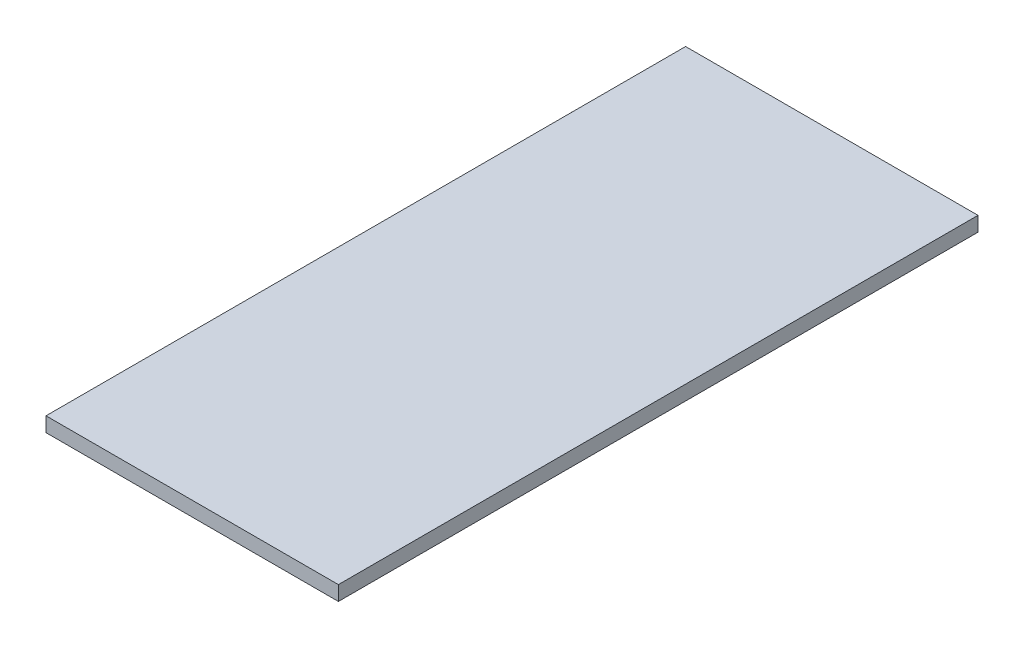
ISO-10303-21;
HEADER;
FILE_DESCRIPTION(('STEP AP214'),'2;1');
FILE_NAME('part.step','',(''),(''),'','','');
FILE_SCHEMA(('AUTOMOTIVE_DESIGN { 1 0 10303 214 1 1 1 1 }'));
ENDSEC;
DATA;
#1=APPLICATION_CONTEXT('core data for automotive mechanical design processes');
#2=APPLICATION_PROTOCOL_DEFINITION('international standard','automotive_design',2000,#1);
#3=PRODUCT_CONTEXT('',#1,'mechanical');
#4=PRODUCT('Part','Part','',(#3));
#5=PRODUCT_RELATED_PRODUCT_CATEGORY('part','',(#4));
#6=PRODUCT_DEFINITION_FORMATION('','',#4);
#7=PRODUCT_DEFINITION_CONTEXT('part definition',#1,'design');
#8=PRODUCT_DEFINITION('design','',#6,#7);
#9=PRODUCT_DEFINITION_SHAPE('','',#8);
#10=(LENGTH_UNIT() NAMED_UNIT(*) SI_UNIT(.MILLI.,.METRE.));
#11=(NAMED_UNIT(*) PLANE_ANGLE_UNIT() SI_UNIT($,.RADIAN.));
#12=(NAMED_UNIT(*) SI_UNIT($,.STERADIAN.) SOLID_ANGLE_UNIT());
#13=UNCERTAINTY_MEASURE_WITH_UNIT(LENGTH_MEASURE(1.E-05),#10,'distance_accuracy_value','');
#14=(GEOMETRIC_REPRESENTATION_CONTEXT(3) GLOBAL_UNCERTAINTY_ASSIGNED_CONTEXT((#13)) GLOBAL_UNIT_ASSIGNED_CONTEXT((#10,
#11,#12)) REPRESENTATION_CONTEXT('',''));
#15=CARTESIAN_POINT('',(0.,0.,0.));
#16=DIRECTION('',(0.,0.,1.));
#17=DIRECTION('',(1.,0.,0.));
#18=AXIS2_PLACEMENT_3D('',#15,#16,#17);
#19=CARTESIAN_POINT('',(0.,0.,350.));
#20=DIRECTION('',(1.,0.,0.));
#21=DIRECTION('',(0.,0.,-1.));
#22=AXIS2_PLACEMENT_3D('',#19,#20,#21);
#23=PLANE('',#22);
#24=DIRECTION('',(0.,-1.,0.));
#25=VECTOR('',#24,1.);
#26=CARTESIAN_POINT('',(0.,0.,0.));
#27=LINE('',#26,#25);
#28=CARTESIAN_POINT('',(0.,0.,0.));
#29=VERTEX_POINT('',#28);
#30=CARTESIAN_POINT('',(0.,-8.,0.));
#31=VERTEX_POINT('',#30);
#32=EDGE_CURVE('E113',#29,#31,#27,.T.);
#33=ORIENTED_EDGE('',*,*,#32,.T.);
#34=DIRECTION('',(0.,0.,-1.));
#35=VECTOR('',#34,1.);
#36=CARTESIAN_POINT('',(0.,-8.,350.));
#37=LINE('',#36,#35);
#38=CARTESIAN_POINT('',(0.,-8.,350.));
#39=VERTEX_POINT('',#38);
#40=EDGE_CURVE('E11',#39,#31,#37,.T.);
#41=ORIENTED_EDGE('',*,*,#40,.F.);
#42=DIRECTION('',(0.,-1.,0.));
#43=VECTOR('',#42,1.);
#44=CARTESIAN_POINT('',(0.,0.,350.));
#45=LINE('',#44,#43);
#46=CARTESIAN_POINT('',(0.,0.,350.));
#47=VERTEX_POINT('',#46);
#48=EDGE_CURVE('E97',#47,#39,#45,.T.);
#49=ORIENTED_EDGE('',*,*,#48,.F.);
#50=DIRECTION('',(0.,0.,-1.));
#51=VECTOR('',#50,1.);
#52=CARTESIAN_POINT('',(0.,0.,350.));
#53=LINE('',#52,#51);
#54=EDGE_CURVE('E109',#47,#29,#53,.T.);
#55=ORIENTED_EDGE('',*,*,#54,.T.);
#56=EDGE_LOOP('',(#33,#41,#49,#55));
#57=FACE_BOUND('',#56,.T.);
#58=ADVANCED_FACE('F45',(#57),#23,.F.);
#59=CARTESIAN_POINT('',(0.,-8.,350.));
#60=DIRECTION('',(0.,1.,0.));
#61=DIRECTION('',(0.,0.,1.));
#62=AXIS2_PLACEMENT_3D('',#59,#60,#61);
#63=PLANE('',#62);
#64=DIRECTION('',(1.,0.,0.));
#65=VECTOR('',#64,1.);
#66=CARTESIAN_POINT('',(0.,-8.,0.));
#67=LINE('',#66,#65);
#68=CARTESIAN_POINT('',(160.,-8.,0.));
#69=VERTEX_POINT('',#68);
#70=EDGE_CURVE('E102',#31,#69,#67,.T.);
#71=ORIENTED_EDGE('',*,*,#70,.T.);
#72=DIRECTION('',(0.,0.,-1.));
#73=VECTOR('',#72,1.);
#74=CARTESIAN_POINT('',(160.,-8.,350.));
#75=LINE('',#74,#73);
#76=CARTESIAN_POINT('',(160.,-8.,350.));
#77=VERTEX_POINT('',#76);
#78=EDGE_CURVE('E54',#77,#69,#75,.T.);
#79=ORIENTED_EDGE('',*,*,#78,.F.);
#80=DIRECTION('',(1.,0.,0.));
#81=VECTOR('',#80,1.);
#82=CARTESIAN_POINT('',(0.,-8.,350.));
#83=LINE('',#82,#81);
#84=EDGE_CURVE('E92',#39,#77,#83,.T.);
#85=ORIENTED_EDGE('',*,*,#84,.F.);
#86=ORIENTED_EDGE('',*,*,#40,.T.);
#87=EDGE_LOOP('',(#71,#79,#85,#86));
#88=FACE_BOUND('',#87,.T.);
#89=ADVANCED_FACE('F101',(#88),#63,.F.);
#90=CARTESIAN_POINT('',(160.,0.,350.));
#91=DIRECTION('',(-1.,0.,0.));
#92=DIRECTION('',(0.,0.,1.));
#93=AXIS2_PLACEMENT_3D('',#90,#91,#92);
#94=PLANE('',#93);
#95=DIRECTION('',(0.,1.,0.));
#96=VECTOR('',#95,1.);
#97=CARTESIAN_POINT('',(160.,0.,0.));
#98=LINE('',#97,#96);
#99=CARTESIAN_POINT('',(160.,0.,0.));
#100=VERTEX_POINT('',#99);
#101=EDGE_CURVE('E79',#69,#100,#98,.T.);
#102=ORIENTED_EDGE('',*,*,#101,.T.);
#103=DIRECTION('',(0.,0.,-1.));
#104=VECTOR('',#103,1.);
#105=CARTESIAN_POINT('',(160.,0.,350.));
#106=LINE('',#105,#104);
#107=CARTESIAN_POINT('',(160.,0.,350.));
#108=VERTEX_POINT('',#107);
#109=EDGE_CURVE('E104',#108,#100,#106,.T.);
#110=ORIENTED_EDGE('',*,*,#109,.F.);
#111=DIRECTION('',(0.,1.,0.));
#112=VECTOR('',#111,1.);
#113=CARTESIAN_POINT('',(160.,0.,350.));
#114=LINE('',#113,#112);
#115=EDGE_CURVE('E95',#77,#108,#114,.T.);
#116=ORIENTED_EDGE('',*,*,#115,.F.);
#117=ORIENTED_EDGE('',*,*,#78,.T.);
#118=EDGE_LOOP('',(#102,#110,#116,#117));
#119=FACE_BOUND('',#118,.T.);
#120=ADVANCED_FACE('F105',(#119),#94,.F.);
#121=CARTESIAN_POINT('',(0.,0.,350.));
#122=DIRECTION('',(0.,-1.,0.));
#123=DIRECTION('',(0.,0.,-1.));
#124=AXIS2_PLACEMENT_3D('',#121,#122,#123);
#125=PLANE('',#124);
#126=DIRECTION('',(-1.,0.,0.));
#127=VECTOR('',#126,1.);
#128=CARTESIAN_POINT('',(0.,0.,0.));
#129=LINE('',#128,#127);
#130=EDGE_CURVE('E85',#100,#29,#129,.T.);
#131=ORIENTED_EDGE('',*,*,#130,.T.);
#132=ORIENTED_EDGE('',*,*,#54,.F.);
#133=DIRECTION('',(-1.,0.,0.));
#134=VECTOR('',#133,1.);
#135=CARTESIAN_POINT('',(0.,0.,350.));
#136=LINE('',#135,#134);
#137=EDGE_CURVE('E62',#108,#47,#136,.T.);
#138=ORIENTED_EDGE('',*,*,#137,.F.);
#139=ORIENTED_EDGE('',*,*,#109,.T.);
#140=EDGE_LOOP('',(#131,#132,#138,#139));
#141=FACE_BOUND('',#140,.T.);
#142=ADVANCED_FACE('F126',(#141),#125,.F.);
#143=CARTESIAN_POINT('',(0.,0.,350.));
#144=DIRECTION('',(0.,0.,1.));
#145=DIRECTION('',(1.,0.,0.));
#146=AXIS2_PLACEMENT_3D('',#143,#144,#145);
#147=PLANE('',#146);
#148=ORIENTED_EDGE('',*,*,#48,.T.);
#149=ORIENTED_EDGE('',*,*,#84,.T.);
#150=ORIENTED_EDGE('',*,*,#115,.T.);
#151=ORIENTED_EDGE('',*,*,#137,.T.);
#152=EDGE_LOOP('',(#148,#149,#150,#151));
#153=FACE_BOUND('',#152,.T.);
#154=ADVANCED_FACE('F93',(#153),#147,.T.);
#155=CARTESIAN_POINT('',(0.,0.,0.));
#156=DIRECTION('',(0.,0.,1.));
#157=DIRECTION('',(1.,0.,0.));
#158=AXIS2_PLACEMENT_3D('',#155,#156,#157);
#159=PLANE('',#158);
#160=ORIENTED_EDGE('',*,*,#32,.F.);
#161=ORIENTED_EDGE('',*,*,#130,.F.);
#162=ORIENTED_EDGE('',*,*,#101,.F.);
#163=ORIENTED_EDGE('',*,*,#70,.F.);
#164=EDGE_LOOP('',(#160,#161,#162,#163));
#165=FACE_BOUND('',#164,.T.);
#166=ADVANCED_FACE('F129',(#165),#159,.F.);
#167=CLOSED_SHELL('',(#58,#89,#120,#142,#154,#166));
#168=MANIFOLD_SOLID_BREP('B2',#167);
#169=ADVANCED_BREP_SHAPE_REPRESENTATION('',(#18,#168),#14);
#170=SHAPE_DEFINITION_REPRESENTATION(#9,#169);
ENDSEC;
END-ISO-10303-21;
